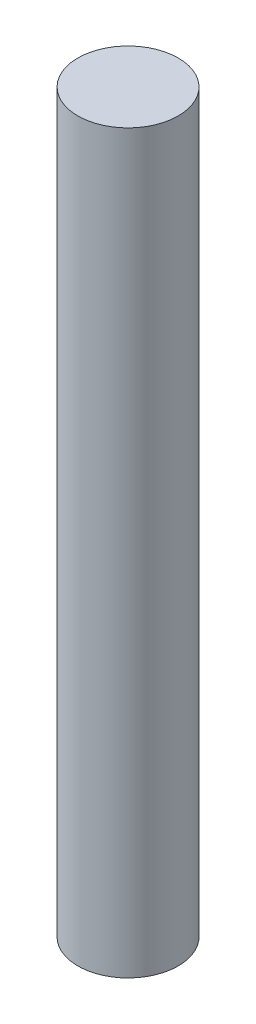
ISO-10303-21;
HEADER;
FILE_DESCRIPTION(('STEP AP214'),'2;1');
FILE_NAME('part.step','',(''),(''),'','','');
FILE_SCHEMA(('AUTOMOTIVE_DESIGN { 1 0 10303 214 1 1 1 1 }'));
ENDSEC;
DATA;
#1=APPLICATION_CONTEXT('core data for automotive mechanical design processes');
#2=APPLICATION_PROTOCOL_DEFINITION('international standard','automotive_design',2000,#1);
#3=PRODUCT_CONTEXT('',#1,'mechanical');
#4=PRODUCT('Part','Part','',(#3));
#5=PRODUCT_RELATED_PRODUCT_CATEGORY('part','',(#4));
#6=PRODUCT_DEFINITION_FORMATION('','',#4);
#7=PRODUCT_DEFINITION_CONTEXT('part definition',#1,'design');
#8=PRODUCT_DEFINITION('design','',#6,#7);
#9=PRODUCT_DEFINITION_SHAPE('','',#8);
#10=(LENGTH_UNIT() NAMED_UNIT(*) SI_UNIT(.MILLI.,.METRE.));
#11=(NAMED_UNIT(*) PLANE_ANGLE_UNIT() SI_UNIT($,.RADIAN.));
#12=(NAMED_UNIT(*) SI_UNIT($,.STERADIAN.) SOLID_ANGLE_UNIT());
#13=UNCERTAINTY_MEASURE_WITH_UNIT(LENGTH_MEASURE(1.E-05),#10,'distance_accuracy_value','');
#14=(GEOMETRIC_REPRESENTATION_CONTEXT(3) GLOBAL_UNCERTAINTY_ASSIGNED_CONTEXT((#13)) GLOBAL_UNIT_ASSIGNED_CONTEXT((#10,
#11,#12)) REPRESENTATION_CONTEXT('',''));
#15=CARTESIAN_POINT('',(0.,0.,0.));
#16=DIRECTION('',(0.,0.,1.));
#17=DIRECTION('',(1.,0.,0.));
#18=AXIS2_PLACEMENT_3D('',#15,#16,#17);
#19=CARTESIAN_POINT('',(0.,0.,0.));
#20=DIRECTION('',(0.,-1.,0.));
#21=DIRECTION('',(0.,0.,-1.));
#22=AXIS2_PLACEMENT_3D('',#19,#20,#21);
#23=PLANE('',#22);
#24=CARTESIAN_POINT('',(0.,0.,0.));
#25=DIRECTION('',(0.,1.,0.));
#26=DIRECTION('',(0.,0.,1.));
#27=AXIS2_PLACEMENT_3D('',#24,#25,#26);
#28=CIRCLE('',#27,4.);
#29=CARTESIAN_POINT('',(0.,0.,4.));
#30=VERTEX_POINT('',#29);
#31=EDGE_CURVE('E51',#30,#30,#28,.T.);
#32=ORIENTED_EDGE('',*,*,#31,.T.);
#33=EDGE_LOOP('',(#32));
#34=FACE_BOUND('',#33,.T.);
#35=CARTESIAN_POINT('',(0.,0.,0.));
#36=DIRECTION('',(0.,-1.,0.));
#37=DIRECTION('',(0.,0.,-1.));
#38=AXIS2_PLACEMENT_3D('',#35,#36,#37);
#39=CIRCLE('',#38,15.);
#40=CARTESIAN_POINT('',(0.,0.,-15.));
#41=VERTEX_POINT('',#40);
#42=EDGE_CURVE('E10',#41,#41,#39,.T.);
#43=ORIENTED_EDGE('',*,*,#42,.T.);
#44=EDGE_LOOP('',(#43));
#45=FACE_BOUND('',#44,.T.);
#46=ADVANCED_FACE('F37',(#34,#45),#23,.T.);
#47=CARTESIAN_POINT('',(0.,0.,0.));
#48=DIRECTION('',(0.,-1.,0.));
#49=DIRECTION('',(0.,0.,-1.));
#50=AXIS2_PLACEMENT_3D('',#47,#48,#49);
#51=CYLINDRICAL_SURFACE('',#50,15.);
#52=CARTESIAN_POINT('',(0.,220.,0.));
#53=DIRECTION('',(0.,-1.,0.));
#54=DIRECTION('',(0.,0.,-1.));
#55=AXIS2_PLACEMENT_3D('',#52,#53,#54);
#56=CIRCLE('',#55,15.);
#57=CARTESIAN_POINT('',(0.,220.,-15.));
#58=VERTEX_POINT('',#57);
#59=EDGE_CURVE('E43',#58,#58,#56,.T.);
#60=ORIENTED_EDGE('',*,*,#59,.T.);
#61=EDGE_LOOP('',(#60));
#62=FACE_BOUND('',#61,.T.);
#63=ORIENTED_EDGE('',*,*,#42,.F.);
#64=EDGE_LOOP('',(#63));
#65=FACE_BOUND('',#64,.T.);
#66=ADVANCED_FACE('F71',(#62,#65),#51,.T.);
#67=CARTESIAN_POINT('',(15.,220.,0.));
#68=DIRECTION('',(0.,1.,0.));
#69=DIRECTION('',(0.,0.,1.));
#70=AXIS2_PLACEMENT_3D('',#67,#68,#69);
#71=PLANE('',#70);
#72=ORIENTED_EDGE('',*,*,#59,.F.);
#73=EDGE_LOOP('',(#72));
#74=FACE_BOUND('',#73,.T.);
#75=ADVANCED_FACE('F61',(#74),#71,.T.);
#76=CARTESIAN_POINT('',(0.,14.,0.));
#77=DIRECTION('',(0.,-1.,0.));
#78=DIRECTION('',(0.,0.,-1.));
#79=AXIS2_PLACEMENT_3D('',#76,#77,#78);
#80=CYLINDRICAL_SURFACE('',#79,4.);
#81=CARTESIAN_POINT('',(0.,14.,0.));
#82=DIRECTION('',(0.,1.,0.));
#83=DIRECTION('',(0.,0.,1.));
#84=AXIS2_PLACEMENT_3D('',#81,#82,#83);
#85=CIRCLE('',#84,4.);
#86=CARTESIAN_POINT('',(0.,14.,4.));
#87=VERTEX_POINT('',#86);
#88=EDGE_CURVE('E47',#87,#87,#85,.T.);
#89=ORIENTED_EDGE('',*,*,#88,.T.);
#90=EDGE_LOOP('',(#89));
#91=FACE_BOUND('',#90,.T.);
#92=ORIENTED_EDGE('',*,*,#31,.F.);
#93=EDGE_LOOP('',(#92));
#94=FACE_BOUND('',#93,.T.);
#95=ADVANCED_FACE('F58',(#91,#94),#80,.F.);
#96=CARTESIAN_POINT('',(0.,14.,0.));
#97=DIRECTION('',(0.,1.,0.));
#98=DIRECTION('',(0.,0.,1.));
#99=AXIS2_PLACEMENT_3D('',#96,#97,#98);
#100=PLANE('',#99);
#101=ORIENTED_EDGE('',*,*,#88,.F.);
#102=EDGE_LOOP('',(#101));
#103=FACE_BOUND('',#102,.T.);
#104=ADVANCED_FACE('F60',(#103),#100,.F.);
#105=CLOSED_SHELL('',(#46,#66,#75,#95,#104));
#106=MANIFOLD_SOLID_BREP('B2',#105);
#107=ADVANCED_BREP_SHAPE_REPRESENTATION('',(#18,#106),#14);
#108=SHAPE_DEFINITION_REPRESENTATION(#9,#107);
ENDSEC;
END-ISO-10303-21;
